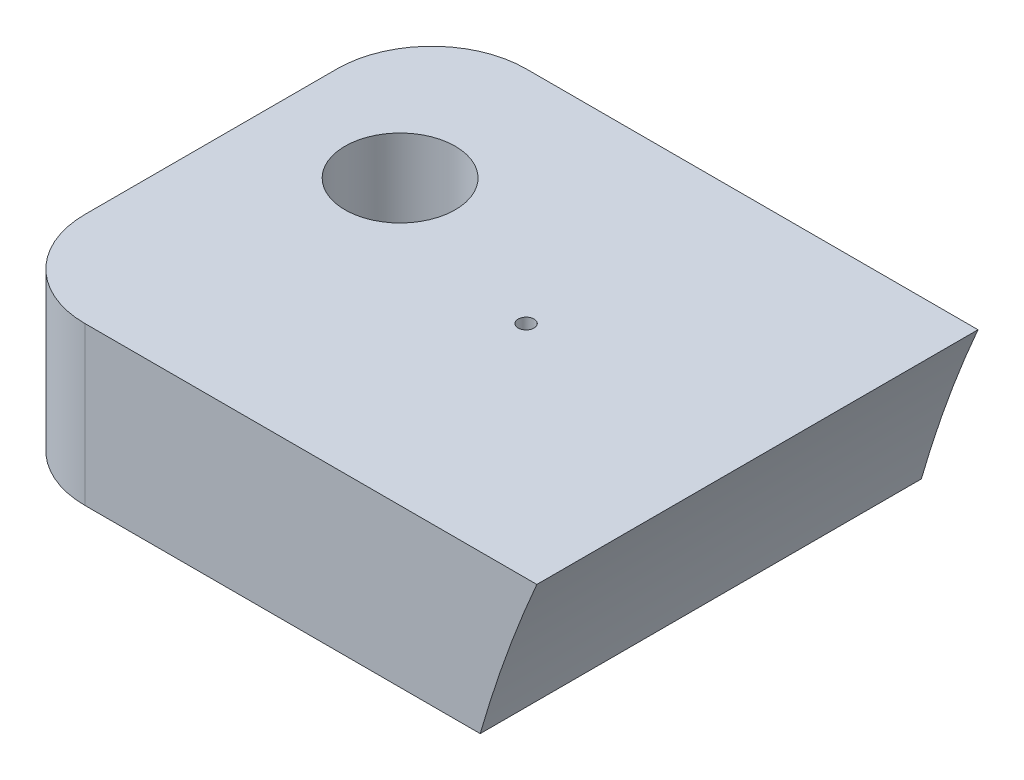
ISO-10303-21;
HEADER;
FILE_DESCRIPTION(('STEP AP214'),'2;1');
FILE_NAME('part.step','',(''),(''),'','','');
FILE_SCHEMA(('AUTOMOTIVE_DESIGN { 1 0 10303 214 1 1 1 1 }'));
ENDSEC;
DATA;
#1=APPLICATION_CONTEXT('core data for automotive mechanical design processes');
#2=APPLICATION_PROTOCOL_DEFINITION('international standard','automotive_design',2000,#1);
#3=PRODUCT_CONTEXT('',#1,'mechanical');
#4=PRODUCT('Part','Part','',(#3));
#5=PRODUCT_RELATED_PRODUCT_CATEGORY('part','',(#4));
#6=PRODUCT_DEFINITION_FORMATION('','',#4);
#7=PRODUCT_DEFINITION_CONTEXT('part definition',#1,'design');
#8=PRODUCT_DEFINITION('design','',#6,#7);
#9=PRODUCT_DEFINITION_SHAPE('','',#8);
#10=(LENGTH_UNIT() NAMED_UNIT(*) SI_UNIT(.MILLI.,.METRE.));
#11=(NAMED_UNIT(*) PLANE_ANGLE_UNIT() SI_UNIT($,.RADIAN.));
#12=(NAMED_UNIT(*) SI_UNIT($,.STERADIAN.) SOLID_ANGLE_UNIT());
#13=UNCERTAINTY_MEASURE_WITH_UNIT(LENGTH_MEASURE(1.E-05),#10,'distance_accuracy_value','');
#14=(GEOMETRIC_REPRESENTATION_CONTEXT(3) GLOBAL_UNCERTAINTY_ASSIGNED_CONTEXT((#13)) GLOBAL_UNIT_ASSIGNED_CONTEXT((#10,
#11,#12)) REPRESENTATION_CONTEXT('',''));
#15=CARTESIAN_POINT('',(0.,0.,0.));
#16=DIRECTION('',(0.,0.,1.));
#17=DIRECTION('',(1.,0.,0.));
#18=AXIS2_PLACEMENT_3D('',#15,#16,#17);
#19=CARTESIAN_POINT('',(0.,0.,0.));
#20=DIRECTION('',(0.,0.,1.));
#21=DIRECTION('',(1.,0.,0.));
#22=AXIS2_PLACEMENT_3D('',#19,#20,#21);
#23=PLANE('',#22);
#24=DIRECTION('',(-1.,0.,0.));
#25=VECTOR('',#24,1.);
#26=CARTESIAN_POINT('',(72.001,16.,0.));
#27=LINE('',#26,#25);
#28=CARTESIAN_POINT('',(-36.6606055596467,16.,0.));
#29=VERTEX_POINT('',#28);
#30=CARTESIAN_POINT('',(-51.,16.,0.));
#31=VERTEX_POINT('',#30);
#32=EDGE_CURVE('E111',#29,#31,#27,.T.);
#33=ORIENTED_EDGE('',*,*,#32,.F.);
#34=CARTESIAN_POINT('',(0.,0.,0.));
#35=DIRECTION('',(0.,0.,1.));
#36=DIRECTION('',(1.,0.,0.));
#37=AXIS2_PLACEMENT_3D('',#34,#35,#36);
#38=CIRCLE('',#37,40.);
#39=CARTESIAN_POINT('',(-38.4577690460588,11.,0.));
#40=VERTEX_POINT('',#39);
#41=EDGE_CURVE('E94',#40,#29,#38,.F.);
#42=ORIENTED_EDGE('',*,*,#41,.F.);
#43=DIRECTION('',(-1.,0.,0.));
#44=VECTOR('',#43,1.);
#45=CARTESIAN_POINT('',(72.001,11.,0.));
#46=LINE('',#45,#44);
#47=CARTESIAN_POINT('',(-51.,11.,0.));
#48=VERTEX_POINT('',#47);
#49=EDGE_CURVE('E108',#40,#48,#46,.T.);
#50=ORIENTED_EDGE('',*,*,#49,.T.);
#51=DIRECTION('',(0.,1.,0.));
#52=VECTOR('',#51,1.);
#53=CARTESIAN_POINT('',(-51.,0.,0.));
#54=LINE('',#53,#52);
#55=EDGE_CURVE('E123',#48,#31,#54,.T.);
#56=ORIENTED_EDGE('',*,*,#55,.T.);
#57=EDGE_LOOP('',(#33,#42,#50,#56));
#58=FACE_BOUND('',#57,.T.);
#59=ADVANCED_FACE('F37',(#58),#23,.F.);
#60=CARTESIAN_POINT('',(72.001,11.,14.));
#61=DIRECTION('',(0.,1.,0.));
#62=DIRECTION('',(0.,0.,1.));
#63=AXIS2_PLACEMENT_3D('',#60,#61,#62);
#64=PLANE('',#63);
#65=CARTESIAN_POINT('',(-44.,11.,6.99999999999999));
#66=DIRECTION('',(0.,-1.,0.));
#67=DIRECTION('',(0.,0.,-1.));
#68=AXIS2_PLACEMENT_3D('',#65,#66,#67);
#69=CIRCLE('',#68,0.25);
#70=CARTESIAN_POINT('',(-44.,11.,6.74999999999999));
#71=VERTEX_POINT('',#70);
#72=EDGE_CURVE('E112',#71,#71,#69,.T.);
#73=ORIENTED_EDGE('',*,*,#72,.F.);
#74=EDGE_LOOP('',(#73));
#75=FACE_BOUND('',#74,.T.);
#76=CARTESIAN_POINT('',(-50.,11.,4.99999999999999));
#77=DIRECTION('',(0.,1.,0.));
#78=DIRECTION('',(0.,0.,1.));
#79=AXIS2_PLACEMENT_3D('',#76,#77,#78);
#80=CIRCLE('',#79,1.75);
#81=CARTESIAN_POINT('',(-50.,11.,6.74999999999999));
#82=VERTEX_POINT('',#81);
#83=EDGE_CURVE('E137',#82,#82,#80,.T.);
#84=ORIENTED_EDGE('',*,*,#83,.T.);
#85=EDGE_LOOP('',(#84));
#86=FACE_BOUND('',#85,.T.);
#87=DIRECTION('',(0.,0.,-1.));
#88=VECTOR('',#87,1.);
#89=CARTESIAN_POINT('',(-54.,11.,14.));
#90=LINE('',#89,#88);
#91=CARTESIAN_POINT('',(-54.,11.,11.));
#92=VERTEX_POINT('',#91);
#93=CARTESIAN_POINT('',(-54.,11.,3.));
#94=VERTEX_POINT('',#93);
#95=EDGE_CURVE('E132',#92,#94,#90,.T.);
#96=ORIENTED_EDGE('',*,*,#95,.T.);
#97=CARTESIAN_POINT('',(-51.,11.,3.));
#98=DIRECTION('',(0.,1.,0.));
#99=DIRECTION('',(0.,0.,1.));
#100=AXIS2_PLACEMENT_3D('',#97,#98,#99);
#101=CIRCLE('',#100,3.);
#102=EDGE_CURVE('E45',#94,#48,#101,.F.);
#103=ORIENTED_EDGE('',*,*,#102,.T.);
#104=ORIENTED_EDGE('',*,*,#49,.F.);
#105=DIRECTION('',(0.,0.,-1.));
#106=VECTOR('',#105,1.);
#107=CARTESIAN_POINT('',(-38.4577690460588,11.0000000000001,200.));
#108=LINE('',#107,#106);
#109=CARTESIAN_POINT('',(-38.4577690460588,11.,14.));
#110=VERTEX_POINT('',#109);
#111=EDGE_CURVE('E91',#110,#40,#108,.T.);
#112=ORIENTED_EDGE('',*,*,#111,.F.);
#113=DIRECTION('',(-1.,0.,0.));
#114=VECTOR('',#113,1.);
#115=CARTESIAN_POINT('',(72.001,11.,14.));
#116=LINE('',#115,#114);
#117=CARTESIAN_POINT('',(-51.,11.,14.));
#118=VERTEX_POINT('',#117);
#119=EDGE_CURVE('E133',#110,#118,#116,.T.);
#120=ORIENTED_EDGE('',*,*,#119,.T.);
#121=CARTESIAN_POINT('',(-51.,11.,11.));
#122=DIRECTION('',(0.,1.,0.));
#123=DIRECTION('',(0.,0.,1.));
#124=AXIS2_PLACEMENT_3D('',#121,#122,#123);
#125=CIRCLE('',#124,3.);
#126=EDGE_CURVE('E52',#118,#92,#125,.F.);
#127=ORIENTED_EDGE('',*,*,#126,.T.);
#128=EDGE_LOOP('',(#96,#103,#104,#112,#120,#127));
#129=FACE_BOUND('',#128,.T.);
#130=ADVANCED_FACE('F114',(#75,#86,#129),#64,.F.);
#131=CARTESIAN_POINT('',(72.001,16.,14.));
#132=DIRECTION('',(0.,-1.,0.));
#133=DIRECTION('',(0.,0.,-1.));
#134=AXIS2_PLACEMENT_3D('',#131,#132,#133);
#135=PLANE('',#134);
#136=CARTESIAN_POINT('',(-44.,16.,6.99999999999999));
#137=DIRECTION('',(0.,-1.,0.));
#138=DIRECTION('',(0.,0.,-1.));
#139=AXIS2_PLACEMENT_3D('',#136,#137,#138);
#140=CIRCLE('',#139,0.25);
#141=CARTESIAN_POINT('',(-44.,16.,6.74999999999999));
#142=VERTEX_POINT('',#141);
#143=EDGE_CURVE('E154',#142,#142,#140,.F.);
#144=ORIENTED_EDGE('',*,*,#143,.F.);
#145=EDGE_LOOP('',(#144));
#146=FACE_BOUND('',#145,.T.);
#147=CARTESIAN_POINT('',(-50.,16.,4.99999999999999));
#148=DIRECTION('',(0.,-1.,0.));
#149=DIRECTION('',(0.,0.,-1.));
#150=AXIS2_PLACEMENT_3D('',#147,#148,#149);
#151=CIRCLE('',#150,1.75);
#152=CARTESIAN_POINT('',(-50.,16.,3.24999999999999));
#153=VERTEX_POINT('',#152);
#154=EDGE_CURVE('E151',#153,#153,#151,.F.);
#155=ORIENTED_EDGE('',*,*,#154,.F.);
#156=EDGE_LOOP('',(#155));
#157=FACE_BOUND('',#156,.T.);
#158=ORIENTED_EDGE('',*,*,#32,.T.);
#159=CARTESIAN_POINT('',(-51.,16.,3.));
#160=DIRECTION('',(0.,-1.,0.));
#161=DIRECTION('',(0.,0.,-1.));
#162=AXIS2_PLACEMENT_3D('',#159,#160,#161);
#163=CIRCLE('',#162,3.);
#164=CARTESIAN_POINT('',(-54.,16.,3.));
#165=VERTEX_POINT('',#164);
#166=EDGE_CURVE('E127',#31,#165,#163,.F.);
#167=ORIENTED_EDGE('',*,*,#166,.T.);
#168=DIRECTION('',(0.,0.,1.));
#169=VECTOR('',#168,1.);
#170=CARTESIAN_POINT('',(-54.,16.,14.));
#171=LINE('',#170,#169);
#172=CARTESIAN_POINT('',(-54.,16.,11.));
#173=VERTEX_POINT('',#172);
#174=EDGE_CURVE('E136',#165,#173,#171,.T.);
#175=ORIENTED_EDGE('',*,*,#174,.T.);
#176=CARTESIAN_POINT('',(-51.,16.,11.));
#177=DIRECTION('',(0.,-1.,0.));
#178=DIRECTION('',(0.,0.,-1.));
#179=AXIS2_PLACEMENT_3D('',#176,#177,#178);
#180=CIRCLE('',#179,3.);
#181=CARTESIAN_POINT('',(-51.,16.,14.));
#182=VERTEX_POINT('',#181);
#183=EDGE_CURVE('E125',#173,#182,#180,.F.);
#184=ORIENTED_EDGE('',*,*,#183,.T.);
#185=DIRECTION('',(-1.,0.,0.));
#186=VECTOR('',#185,1.);
#187=CARTESIAN_POINT('',(72.001,16.,14.));
#188=LINE('',#187,#186);
#189=CARTESIAN_POINT('',(-36.6606055596467,16.,14.));
#190=VERTEX_POINT('',#189);
#191=EDGE_CURVE('E118',#190,#182,#188,.T.);
#192=ORIENTED_EDGE('',*,*,#191,.F.);
#193=DIRECTION('',(0.,0.,-1.));
#194=VECTOR('',#193,1.);
#195=CARTESIAN_POINT('',(-36.6606055596467,16.,200.));
#196=LINE('',#195,#194);
#197=EDGE_CURVE('E102',#29,#190,#196,.F.);
#198=ORIENTED_EDGE('',*,*,#197,.F.);
#199=EDGE_LOOP('',(#158,#167,#175,#184,#192,#198));
#200=FACE_BOUND('',#199,.T.);
#201=ADVANCED_FACE('F143',(#146,#157,#200),#135,.F.);
#202=CARTESIAN_POINT('',(72.001,11.,14.));
#203=DIRECTION('',(0.,0.,-1.));
#204=DIRECTION('',(0.,1.,0.));
#205=AXIS2_PLACEMENT_3D('',#202,#203,#204);
#206=PLANE('',#205);
#207=ORIENTED_EDGE('',*,*,#191,.T.);
#208=DIRECTION('',(0.,-1.,0.));
#209=VECTOR('',#208,1.);
#210=CARTESIAN_POINT('',(-51.,11.,14.));
#211=LINE('',#210,#209);
#212=EDGE_CURVE('E11',#182,#118,#211,.T.);
#213=ORIENTED_EDGE('',*,*,#212,.T.);
#214=ORIENTED_EDGE('',*,*,#119,.F.);
#215=CARTESIAN_POINT('',(0.,0.,14.));
#216=DIRECTION('',(0.,0.,-1.));
#217=DIRECTION('',(0.,1.,0.));
#218=AXIS2_PLACEMENT_3D('',#215,#216,#217);
#219=CIRCLE('',#218,40.);
#220=EDGE_CURVE('E97',#190,#110,#219,.F.);
#221=ORIENTED_EDGE('',*,*,#220,.F.);
#222=EDGE_LOOP('',(#207,#213,#214,#221));
#223=FACE_BOUND('',#222,.T.);
#224=ADVANCED_FACE('F145',(#223),#206,.F.);
#225=CARTESIAN_POINT('',(-54.,0.,0.));
#226=DIRECTION('',(1.,0.,0.));
#227=DIRECTION('',(0.,0.,-1.));
#228=AXIS2_PLACEMENT_3D('',#225,#226,#227);
#229=PLANE('',#228);
#230=ORIENTED_EDGE('',*,*,#174,.F.);
#231=DIRECTION('',(0.,1.,0.));
#232=VECTOR('',#231,1.);
#233=CARTESIAN_POINT('',(-54.,0.,3.));
#234=LINE('',#233,#232);
#235=EDGE_CURVE('E59',#165,#94,#234,.F.);
#236=ORIENTED_EDGE('',*,*,#235,.T.);
#237=ORIENTED_EDGE('',*,*,#95,.F.);
#238=DIRECTION('',(0.,-1.,0.));
#239=VECTOR('',#238,1.);
#240=CARTESIAN_POINT('',(-54.,0.,11.));
#241=LINE('',#240,#239);
#242=EDGE_CURVE('E129',#92,#173,#241,.F.);
#243=ORIENTED_EDGE('',*,*,#242,.T.);
#244=EDGE_LOOP('',(#230,#236,#237,#243));
#245=FACE_BOUND('',#244,.T.);
#246=ADVANCED_FACE('F134',(#245),#229,.F.);
#247=CARTESIAN_POINT('',(-50.,20.9497474683059,4.99999999999999));
#248=DIRECTION('',(0.,-1.,0.));
#249=DIRECTION('',(0.,0.,-1.));
#250=AXIS2_PLACEMENT_3D('',#247,#248,#249);
#251=CYLINDRICAL_SURFACE('',#250,1.75);
#252=ORIENTED_EDGE('',*,*,#154,.T.);
#253=EDGE_LOOP('',(#252));
#254=FACE_BOUND('',#253,.T.);
#255=ORIENTED_EDGE('',*,*,#83,.F.);
#256=EDGE_LOOP('',(#255));
#257=FACE_BOUND('',#256,.T.);
#258=ADVANCED_FACE('F168',(#254,#257),#251,.F.);
#259=CARTESIAN_POINT('',(-51.,0.,3.));
#260=DIRECTION('',(0.,1.,0.));
#261=DIRECTION('',(0.,0.,1.));
#262=AXIS2_PLACEMENT_3D('',#259,#260,#261);
#263=CYLINDRICAL_SURFACE('',#262,3.);
#264=ORIENTED_EDGE('',*,*,#102,.F.);
#265=ORIENTED_EDGE('',*,*,#235,.F.);
#266=ORIENTED_EDGE('',*,*,#166,.F.);
#267=ORIENTED_EDGE('',*,*,#55,.F.);
#268=EDGE_LOOP('',(#264,#265,#266,#267));
#269=FACE_BOUND('',#268,.T.);
#270=ADVANCED_FACE('F170',(#269),#263,.T.);
#271=CARTESIAN_POINT('',(-51.,11.,11.));
#272=DIRECTION('',(0.,-1.,0.));
#273=DIRECTION('',(0.,0.,-1.));
#274=AXIS2_PLACEMENT_3D('',#271,#272,#273);
#275=CYLINDRICAL_SURFACE('',#274,3.);
#276=ORIENTED_EDGE('',*,*,#183,.F.);
#277=ORIENTED_EDGE('',*,*,#242,.F.);
#278=ORIENTED_EDGE('',*,*,#126,.F.);
#279=ORIENTED_EDGE('',*,*,#212,.F.);
#280=EDGE_LOOP('',(#276,#277,#278,#279));
#281=FACE_BOUND('',#280,.T.);
#282=ADVANCED_FACE('F39',(#281),#275,.T.);
#283=CARTESIAN_POINT('',(-44.,40.001,6.99999999999999));
#284=DIRECTION('',(0.,-1.,0.));
#285=DIRECTION('',(0.,0.,-1.));
#286=AXIS2_PLACEMENT_3D('',#283,#284,#285);
#287=CYLINDRICAL_SURFACE('',#286,0.25);
#288=ORIENTED_EDGE('',*,*,#72,.T.);
#289=EDGE_LOOP('',(#288));
#290=FACE_BOUND('',#289,.T.);
#291=ORIENTED_EDGE('',*,*,#143,.T.);
#292=EDGE_LOOP('',(#291));
#293=FACE_BOUND('',#292,.T.);
#294=ADVANCED_FACE('F160',(#290,#293),#287,.F.);
#295=CARTESIAN_POINT('',(0.,0.,-2.001));
#296=DIRECTION('',(0.,0.,1.));
#297=DIRECTION('',(1.,0.,0.));
#298=AXIS2_PLACEMENT_3D('',#295,#296,#297);
#299=CYLINDRICAL_SURFACE('',#298,40.);
#300=ORIENTED_EDGE('',*,*,#41,.T.);
#301=ORIENTED_EDGE('',*,*,#197,.T.);
#302=ORIENTED_EDGE('',*,*,#220,.T.);
#303=ORIENTED_EDGE('',*,*,#111,.T.);
#304=EDGE_LOOP('',(#300,#301,#302,#303));
#305=FACE_BOUND('',#304,.T.);
#306=ADVANCED_FACE('F93',(#305),#299,.F.);
#307=CLOSED_SHELL('',(#59,#130,#201,#224,#246,#258,#270,#282,#294,#306));
#308=MANIFOLD_SOLID_BREP('B2',#307);
#309=ADVANCED_BREP_SHAPE_REPRESENTATION('',(#18,#308),#14);
#310=SHAPE_DEFINITION_REPRESENTATION(#9,#309);
ENDSEC;
END-ISO-10303-21;
